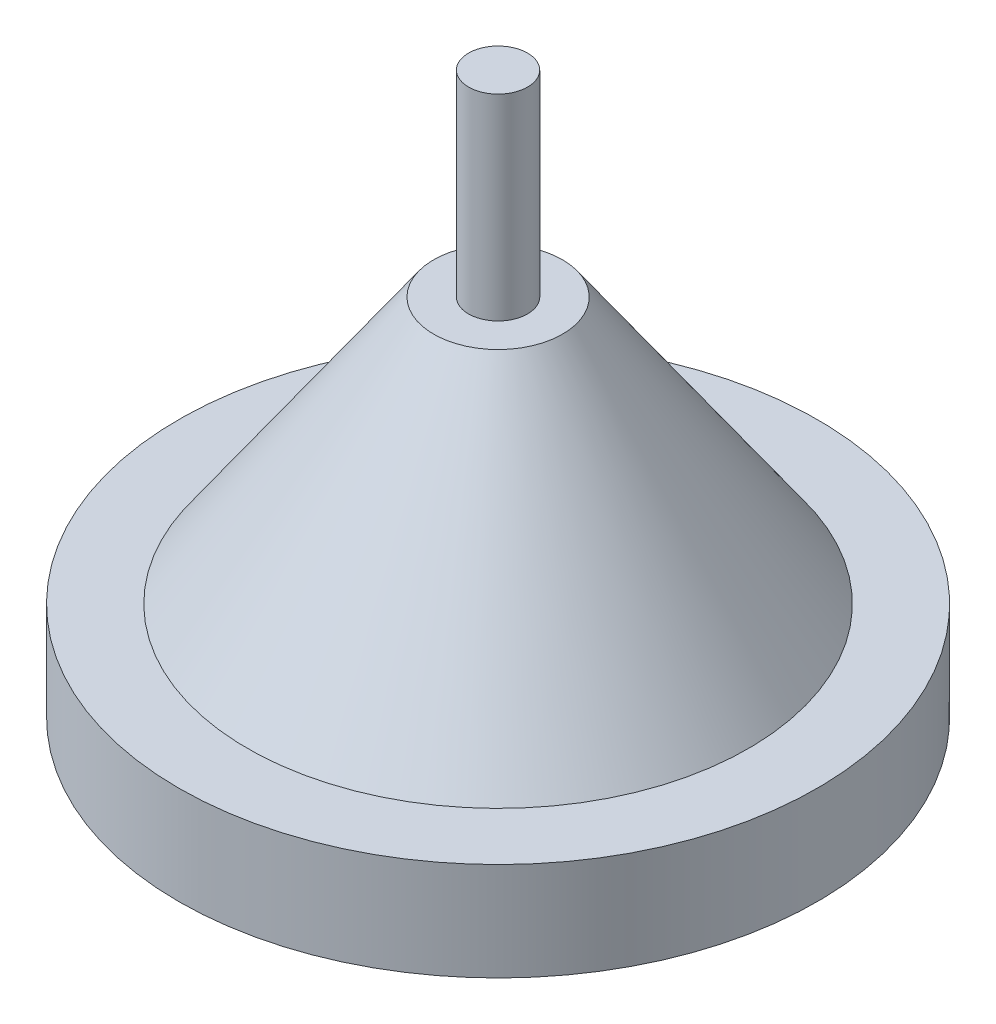
ISO-10303-21;
HEADER;
FILE_DESCRIPTION(('STEP AP214'),'2;1');
FILE_NAME('part.step','',(''),(''),'','','');
FILE_SCHEMA(('AUTOMOTIVE_DESIGN { 1 0 10303 214 1 1 1 1 }'));
ENDSEC;
DATA;
#1=APPLICATION_CONTEXT('core data for automotive mechanical design processes');
#2=APPLICATION_PROTOCOL_DEFINITION('international standard','automotive_design',2000,#1);
#3=PRODUCT_CONTEXT('',#1,'mechanical');
#4=PRODUCT('Part','Part','',(#3));
#5=PRODUCT_RELATED_PRODUCT_CATEGORY('part','',(#4));
#6=PRODUCT_DEFINITION_FORMATION('','',#4);
#7=PRODUCT_DEFINITION_CONTEXT('part definition',#1,'design');
#8=PRODUCT_DEFINITION('design','',#6,#7);
#9=PRODUCT_DEFINITION_SHAPE('','',#8);
#10=(LENGTH_UNIT() NAMED_UNIT(*) SI_UNIT(.MILLI.,.METRE.));
#11=(NAMED_UNIT(*) PLANE_ANGLE_UNIT() SI_UNIT($,.RADIAN.));
#12=(NAMED_UNIT(*) SI_UNIT($,.STERADIAN.) SOLID_ANGLE_UNIT());
#13=UNCERTAINTY_MEASURE_WITH_UNIT(LENGTH_MEASURE(1.E-05),#10,'distance_accuracy_value','');
#14=(GEOMETRIC_REPRESENTATION_CONTEXT(3) GLOBAL_UNCERTAINTY_ASSIGNED_CONTEXT((#13)) GLOBAL_UNIT_ASSIGNED_CONTEXT((#10,
#11,#12)) REPRESENTATION_CONTEXT('',''));
#15=CARTESIAN_POINT('',(0.,0.,0.));
#16=DIRECTION('',(0.,0.,1.));
#17=DIRECTION('',(1.,0.,0.));
#18=AXIS2_PLACEMENT_3D('',#15,#16,#17);
#19=CARTESIAN_POINT('',(0.,27.05,0.));
#20=DIRECTION('',(0.,1.,0.));
#21=DIRECTION('',(0.,0.,1.));
#22=AXIS2_PLACEMENT_3D('',#19,#20,#21);
#23=PLANE('',#22);
#24=CARTESIAN_POINT('',(0.,27.05,0.));
#25=DIRECTION('',(0.,1.,0.));
#26=DIRECTION('',(0.,0.,1.));
#27=AXIS2_PLACEMENT_3D('',#24,#25,#26);
#28=CIRCLE('',#27,3.);
#29=CARTESIAN_POINT('',(0.,27.05,3.));
#30=VERTEX_POINT('',#29);
#31=EDGE_CURVE('E11',#30,#30,#28,.T.);
#32=ORIENTED_EDGE('',*,*,#31,.F.);
#33=EDGE_LOOP('',(#32));
#34=FACE_BOUND('',#33,.T.);
#35=CARTESIAN_POINT('',(0.,27.05,0.));
#36=DIRECTION('',(0.,1.,0.));
#37=DIRECTION('',(0.,0.,1.));
#38=AXIS2_PLACEMENT_3D('',#35,#36,#37);
#39=CIRCLE('',#38,6.56);
#40=CARTESIAN_POINT('',(0.,27.05,-6.56));
#41=VERTEX_POINT('',#40);
#42=EDGE_CURVE('E43',#41,#41,#39,.T.);
#43=ORIENTED_EDGE('',*,*,#42,.T.);
#44=EDGE_LOOP('',(#43));
#45=FACE_BOUND('',#44,.T.);
#46=ADVANCED_FACE('F34',(#34,#45),#23,.T.);
#47=CARTESIAN_POINT('',(0.,27.05,0.));
#48=DIRECTION('',(0.,-1.,0.));
#49=DIRECTION('',(0.,0.,-1.));
#50=AXIS2_PLACEMENT_3D('',#47,#48,#49);
#51=CONICAL_SURFACE('',#50,6.56,0.610850009243192);
#52=CARTESIAN_POINT('',(0.,0.,0.));
#53=DIRECTION('',(0.,1.,0.));
#54=DIRECTION('',(0.,0.,1.));
#55=AXIS2_PLACEMENT_3D('',#52,#53,#54);
#56=CIRCLE('',#55,25.5);
#57=CARTESIAN_POINT('',(0.,0.,-25.5));
#58=VERTEX_POINT('',#57);
#59=EDGE_CURVE('E39',#58,#58,#56,.T.);
#60=CARTESIAN_POINT('',(0.,27.05,-6.56));
#61=CARTESIAN_POINT('',(0.,26.7682291666667,-6.75729166666667));
#62=CARTESIAN_POINT('',(0.,26.4864583333333,-6.95458333333334));
#63=CARTESIAN_POINT('',(0.,25.9229166666667,-7.34916666666667));
#64=CARTESIAN_POINT('',(0.,25.6411458333333,-7.54645833333333));
#65=CARTESIAN_POINT('',(0.,25.0776041666667,-7.94104166666667));
#66=CARTESIAN_POINT('',(0.,24.7958333333333,-8.13833333333333));
#67=CARTESIAN_POINT('',(0.,24.2322916666667,-8.53291666666667));
#68=CARTESIAN_POINT('',(0.,23.9505208333333,-8.73020833333334));
#69=CARTESIAN_POINT('',(0.,23.3869791666667,-9.12479166666667));
#70=CARTESIAN_POINT('',(0.,23.1052083333333,-9.32208333333333));
#71=CARTESIAN_POINT('',(0.,22.5416666666667,-9.71666666666667));
#72=CARTESIAN_POINT('',(0.,22.2598958333333,-9.91395833333333));
#73=CARTESIAN_POINT('',(0.,21.6963541666667,-10.3085416666667));
#74=CARTESIAN_POINT('',(0.,21.4145833333333,-10.5058333333333));
#75=CARTESIAN_POINT('',(0.,20.8510416666667,-10.9004166666667));
#76=CARTESIAN_POINT('',(0.,20.5692708333333,-11.0977083333333));
#77=CARTESIAN_POINT('',(0.,20.0057291666667,-11.4922916666667));
#78=CARTESIAN_POINT('',(0.,19.7239583333333,-11.6895833333333));
#79=CARTESIAN_POINT('',(0.,19.1604166666667,-12.0841666666667));
#80=CARTESIAN_POINT('',(0.,18.8786458333333,-12.2814583333333));
#81=CARTESIAN_POINT('',(0.,18.3151041666667,-12.6760416666667));
#82=CARTESIAN_POINT('',(0.,18.0333333333333,-12.8733333333333));
#83=CARTESIAN_POINT('',(0.,17.4697916666667,-13.2679166666667));
#84=CARTESIAN_POINT('',(0.,17.1880208333333,-13.4652083333333));
#85=CARTESIAN_POINT('',(0.,16.6244791666667,-13.8597916666667));
#86=CARTESIAN_POINT('',(0.,16.3427083333333,-14.0570833333333));
#87=CARTESIAN_POINT('',(0.,15.7791666666667,-14.4516666666667));
#88=CARTESIAN_POINT('',(0.,15.4973958333333,-14.6489583333333));
#89=CARTESIAN_POINT('',(0.,14.9338541666667,-15.0435416666667));
#90=CARTESIAN_POINT('',(0.,14.6520833333333,-15.2408333333333));
#91=CARTESIAN_POINT('',(0.,14.0885416666667,-15.6354166666667));
#92=CARTESIAN_POINT('',(0.,13.8067708333333,-15.8327083333333));
#93=CARTESIAN_POINT('',(0.,13.2432291666667,-16.2272916666667));
#94=CARTESIAN_POINT('',(0.,12.9614583333333,-16.4245833333333));
#95=CARTESIAN_POINT('',(0.,12.3979166666667,-16.8191666666667));
#96=CARTESIAN_POINT('',(0.,12.1161458333333,-17.0164583333333));
#97=CARTESIAN_POINT('',(0.,11.5526041666667,-17.4110416666667));
#98=CARTESIAN_POINT('',(0.,11.2708333333333,-17.6083333333333));
#99=CARTESIAN_POINT('',(0.,10.7072916666667,-18.0029166666667));
#100=CARTESIAN_POINT('',(0.,10.4255208333333,-18.2002083333333));
#101=CARTESIAN_POINT('',(0.,9.86197916666666,-18.5947916666667));
#102=CARTESIAN_POINT('',(0.,9.58020833333333,-18.7920833333333));
#103=CARTESIAN_POINT('',(0.,9.01666666666666,-19.1866666666667));
#104=CARTESIAN_POINT('',(0.,8.73489583333333,-19.3839583333333));
#105=CARTESIAN_POINT('',(0.,8.17135416666666,-19.7785416666667));
#106=CARTESIAN_POINT('',(0.,7.88958333333333,-19.9758333333333));
#107=CARTESIAN_POINT('',(0.,7.32604166666667,-20.3704166666667));
#108=CARTESIAN_POINT('',(0.,7.04427083333333,-20.5677083333333));
#109=CARTESIAN_POINT('',(0.,6.48072916666666,-20.9622916666667));
#110=CARTESIAN_POINT('',(0.,6.19895833333333,-21.1595833333333));
#111=CARTESIAN_POINT('',(0.,5.63541666666666,-21.5541666666667));
#112=CARTESIAN_POINT('',(0.,5.35364583333333,-21.7514583333333));
#113=CARTESIAN_POINT('',(0.,4.79010416666666,-22.1460416666667));
#114=CARTESIAN_POINT('',(0.,4.50833333333333,-22.3433333333333));
#115=CARTESIAN_POINT('',(0.,3.94479166666666,-22.7379166666667));
#116=CARTESIAN_POINT('',(0.,3.66302083333333,-22.9352083333333));
#117=CARTESIAN_POINT('',(0.,3.09947916666666,-23.3297916666667));
#118=CARTESIAN_POINT('',(0.,2.81770833333333,-23.5270833333333));
#119=CARTESIAN_POINT('',(0.,2.25416666666666,-23.9216666666667));
#120=CARTESIAN_POINT('',(0.,1.97239583333333,-24.1189583333333));
#121=CARTESIAN_POINT('',(0.,1.40885416666666,-24.5135416666667));
#122=CARTESIAN_POINT('',(0.,1.12708333333333,-24.7108333333333));
#123=CARTESIAN_POINT('',(0.,0.563541666666663,-25.1054166666667));
#124=CARTESIAN_POINT('',(0.,0.28177083333333,-25.3027083333333));
#125=CARTESIAN_POINT('',(0.,0.,-25.5));
#126=B_SPLINE_CURVE_WITH_KNOTS('',3,(#60,#61,#62,#63,#64,#65,#66,#67,#68,#69,#70,#71,#72,#73,
#74,#75,#76,#77,#78,#79,#80,#81,#82,#83,#84,#85,#86,#87,#88,#89,#90,#91,#92,#93,#94,#95,#96,#97,
#98,#99,#100,#101,#102,#103,#104,#105,#106,#107,#108,#109,#110,#111,#112,#113,#114,#115,#116,
#117,#118,#119,#120,#121,#122,#123,#124,#125),.UNSPECIFIED.,.F.,.F.,(4,2,2,2,2,2,2,2,2,2,2,2,2,
2,2,2,2,2,2,2,2,2,2,2,2,2,2,2,2,2,2,2,4),(0.,1.03192501582297,2.06385003164595,3.09577504746893,
4.1277000632919,5.15962507911488,6.19155009493786,7.22347511076083,8.25540012658381,
9.28732514240679,10.3192501582298,11.3511751740527,12.3831001898757,13.4150252056987,
14.4469502215217,15.4788752373446,16.5108002531676,17.5427252689906,18.5746502848136,
19.6065753006366,20.6385003164595,21.6704253322825,22.7023503481055,23.7342753639285,
24.7662003797514,25.7981253955744,26.8300504113974,27.8619754272204,28.8939004430433,
29.9258254588663,30.9577504746893,31.9896754905123,33.0216005063352),.UNSPECIFIED.);
#127=EDGE_CURVE('BSEAM36',#41,#58,#126,.T.);
#128=ORIENTED_EDGE('',*,*,#42,.F.);
#129=ORIENTED_EDGE('',*,*,#59,.T.);
#130=ORIENTED_EDGE('',*,*,#127,.T.);
#131=ORIENTED_EDGE('',*,*,#127,.F.);
#132=EDGE_LOOP('',(#128,#130,#129,#131));
#133=FACE_BOUND('',#132,.T.);
#134=ADVANCED_FACE('F36',(#133),#51,.T.);
#135=CARTESIAN_POINT('',(0.,-10.,0.));
#136=DIRECTION('',(0.,1.,0.));
#137=DIRECTION('',(0.,0.,1.));
#138=AXIS2_PLACEMENT_3D('',#135,#136,#137);
#139=CYLINDRICAL_SURFACE('',#138,32.5);
#140=CARTESIAN_POINT('',(0.,-10.,0.));
#141=DIRECTION('',(0.,1.,0.));
#142=DIRECTION('',(0.,0.,1.));
#143=AXIS2_PLACEMENT_3D('',#140,#141,#142);
#144=CIRCLE('',#143,32.5);
#145=CARTESIAN_POINT('',(0.,-10.,32.5));
#146=VERTEX_POINT('',#145);
#147=EDGE_CURVE('E52',#146,#146,#144,.T.);
#148=ORIENTED_EDGE('',*,*,#147,.T.);
#149=EDGE_LOOP('',(#148));
#150=FACE_BOUND('',#149,.T.);
#151=CARTESIAN_POINT('',(0.,0.,0.));
#152=DIRECTION('',(0.,1.,0.));
#153=DIRECTION('',(0.,0.,1.));
#154=AXIS2_PLACEMENT_3D('',#151,#152,#153);
#155=CIRCLE('',#154,32.5);
#156=CARTESIAN_POINT('',(0.,0.,32.5));
#157=VERTEX_POINT('',#156);
#158=EDGE_CURVE('E55',#157,#157,#155,.T.);
#159=ORIENTED_EDGE('',*,*,#158,.F.);
#160=EDGE_LOOP('',(#159));
#161=FACE_BOUND('',#160,.T.);
#162=ADVANCED_FACE('F81',(#150,#161),#139,.T.);
#163=CARTESIAN_POINT('',(0.,-10.,0.));
#164=DIRECTION('',(0.,1.,0.));
#165=DIRECTION('',(0.,0.,1.));
#166=AXIS2_PLACEMENT_3D('',#163,#164,#165);
#167=PLANE('',#166);
#168=ORIENTED_EDGE('',*,*,#147,.F.);
#169=EDGE_LOOP('',(#168));
#170=FACE_BOUND('',#169,.T.);
#171=ADVANCED_FACE('F79',(#170),#167,.F.);
#172=CARTESIAN_POINT('',(0.,0.,0.));
#173=DIRECTION('',(0.,1.,0.));
#174=DIRECTION('',(0.,0.,1.));
#175=AXIS2_PLACEMENT_3D('',#172,#173,#174);
#176=PLANE('',#175);
#177=ORIENTED_EDGE('',*,*,#59,.F.);
#178=EDGE_LOOP('',(#177));
#179=FACE_BOUND('',#178,.T.);
#180=ORIENTED_EDGE('',*,*,#158,.T.);
#181=EDGE_LOOP('',(#180));
#182=FACE_BOUND('',#181,.T.);
#183=ADVANCED_FACE('F68',(#179,#182),#176,.T.);
#184=CARTESIAN_POINT('',(0.,47.05,0.));
#185=DIRECTION('',(0.,-1.,0.));
#186=DIRECTION('',(0.,0.,-1.));
#187=AXIS2_PLACEMENT_3D('',#184,#185,#186);
#188=CYLINDRICAL_SURFACE('',#187,3.);
#189=CARTESIAN_POINT('',(0.,47.05,0.));
#190=DIRECTION('',(0.,1.,0.));
#191=DIRECTION('',(0.,0.,1.));
#192=AXIS2_PLACEMENT_3D('',#189,#190,#191);
#193=CIRCLE('',#192,3.);
#194=CARTESIAN_POINT('',(0.,47.05,3.));
#195=VERTEX_POINT('',#194);
#196=EDGE_CURVE('E51',#195,#195,#193,.T.);
#197=ORIENTED_EDGE('',*,*,#196,.F.);
#198=EDGE_LOOP('',(#197));
#199=FACE_BOUND('',#198,.T.);
#200=ORIENTED_EDGE('',*,*,#31,.T.);
#201=EDGE_LOOP('',(#200));
#202=FACE_BOUND('',#201,.T.);
#203=ADVANCED_FACE('F78',(#199,#202),#188,.T.);
#204=CARTESIAN_POINT('',(0.,47.05,0.));
#205=DIRECTION('',(0.,1.,0.));
#206=DIRECTION('',(0.,0.,1.));
#207=AXIS2_PLACEMENT_3D('',#204,#205,#206);
#208=PLANE('',#207);
#209=ORIENTED_EDGE('',*,*,#196,.T.);
#210=EDGE_LOOP('',(#209));
#211=FACE_BOUND('',#210,.T.);
#212=ADVANCED_FACE('F143',(#211),#208,.T.);
#213=CLOSED_SHELL('',(#46,#134,#162,#171,#183,#203,#212));
#214=MANIFOLD_SOLID_BREP('B2',#213);
#215=ADVANCED_BREP_SHAPE_REPRESENTATION('',(#18,#214),#14);
#216=SHAPE_DEFINITION_REPRESENTATION(#9,#215);
ENDSEC;
END-ISO-10303-21;
